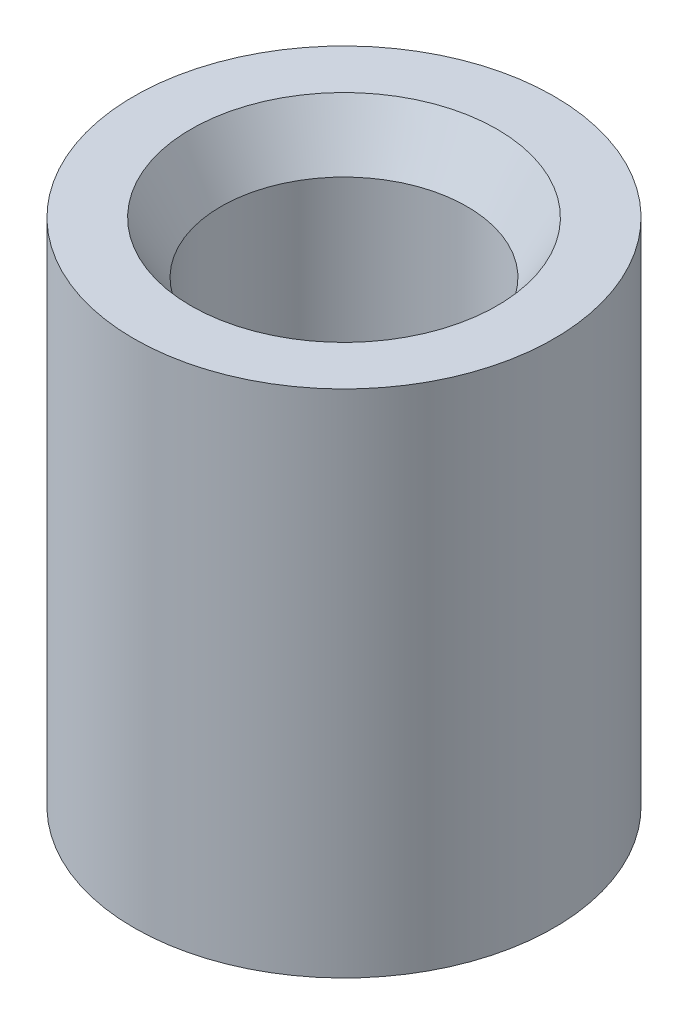
ISO-10303-21;
HEADER;
FILE_DESCRIPTION(('STEP AP214'),'2;1');
FILE_NAME('part.step','',(''),(''),'','','');
FILE_SCHEMA(('AUTOMOTIVE_DESIGN { 1 0 10303 214 1 1 1 1 }'));
ENDSEC;
DATA;
#1=APPLICATION_CONTEXT('core data for automotive mechanical design processes');
#2=APPLICATION_PROTOCOL_DEFINITION('international standard','automotive_design',2000,#1);
#3=PRODUCT_CONTEXT('',#1,'mechanical');
#4=PRODUCT('Part','Part','',(#3));
#5=PRODUCT_RELATED_PRODUCT_CATEGORY('part','',(#4));
#6=PRODUCT_DEFINITION_FORMATION('','',#4);
#7=PRODUCT_DEFINITION_CONTEXT('part definition',#1,'design');
#8=PRODUCT_DEFINITION('design','',#6,#7);
#9=PRODUCT_DEFINITION_SHAPE('','',#8);
#10=(LENGTH_UNIT() NAMED_UNIT(*) SI_UNIT(.MILLI.,.METRE.));
#11=(NAMED_UNIT(*) PLANE_ANGLE_UNIT() SI_UNIT($,.RADIAN.));
#12=(NAMED_UNIT(*) SI_UNIT($,.STERADIAN.) SOLID_ANGLE_UNIT());
#13=UNCERTAINTY_MEASURE_WITH_UNIT(LENGTH_MEASURE(1.E-05),#10,'distance_accuracy_value','');
#14=(GEOMETRIC_REPRESENTATION_CONTEXT(3) GLOBAL_UNCERTAINTY_ASSIGNED_CONTEXT((#13)) GLOBAL_UNIT_ASSIGNED_CONTEXT((#10,
#11,#12)) REPRESENTATION_CONTEXT('',''));
#15=CARTESIAN_POINT('',(0.,0.,0.));
#16=DIRECTION('',(0.,0.,1.));
#17=DIRECTION('',(1.,0.,0.));
#18=AXIS2_PLACEMENT_3D('',#15,#16,#17);
#19=CARTESIAN_POINT('',(0.,17.,0.));
#20=DIRECTION('',(0.,1.,0.));
#21=DIRECTION('',(0.,0.,1.));
#22=AXIS2_PLACEMENT_3D('',#19,#20,#21);
#23=PLANE('',#22);
#24=CARTESIAN_POINT('',(0.,17.,0.));
#25=DIRECTION('',(0.,1.,0.));
#26=DIRECTION('',(0.,0.,1.));
#27=AXIS2_PLACEMENT_3D('',#24,#25,#26);
#28=CIRCLE('',#27,5.1);
#29=CARTESIAN_POINT('',(0.,17.,5.1));
#30=VERTEX_POINT('',#29);
#31=EDGE_CURVE('E11',#30,#30,#28,.F.);
#32=ORIENTED_EDGE('',*,*,#31,.T.);
#33=EDGE_LOOP('',(#32));
#34=FACE_BOUND('',#33,.T.);
#35=CARTESIAN_POINT('',(0.,17.,0.));
#36=DIRECTION('',(0.,1.,0.));
#37=DIRECTION('',(0.,0.,1.));
#38=AXIS2_PLACEMENT_3D('',#35,#36,#37);
#39=CIRCLE('',#38,7.);
#40=CARTESIAN_POINT('',(0.,17.,7.));
#41=VERTEX_POINT('',#40);
#42=EDGE_CURVE('E59',#41,#41,#39,.T.);
#43=ORIENTED_EDGE('',*,*,#42,.T.);
#44=EDGE_LOOP('',(#43));
#45=FACE_BOUND('',#44,.T.);
#46=ADVANCED_FACE('F43',(#34,#45),#23,.T.);
#47=CARTESIAN_POINT('',(0.,0.,0.));
#48=DIRECTION('',(0.,1.,0.));
#49=DIRECTION('',(0.,0.,1.));
#50=AXIS2_PLACEMENT_3D('',#47,#48,#49);
#51=PLANE('',#50);
#52=CARTESIAN_POINT('',(0.,0.,0.));
#53=DIRECTION('',(0.,1.,0.));
#54=DIRECTION('',(0.,0.,1.));
#55=AXIS2_PLACEMENT_3D('',#52,#53,#54);
#56=CIRCLE('',#55,7.);
#57=CARTESIAN_POINT('',(0.,0.,7.));
#58=VERTEX_POINT('',#57);
#59=EDGE_CURVE('E62',#58,#58,#56,.T.);
#60=ORIENTED_EDGE('',*,*,#59,.F.);
#61=EDGE_LOOP('',(#60));
#62=FACE_BOUND('',#61,.T.);
#63=ADVANCED_FACE('F73',(#62),#51,.F.);
#64=CARTESIAN_POINT('',(0.,17.,0.));
#65=DIRECTION('',(0.,-1.,0.));
#66=DIRECTION('',(0.,0.,-1.));
#67=AXIS2_PLACEMENT_3D('',#64,#65,#66);
#68=CYLINDRICAL_SURFACE('',#67,7.);
#69=ORIENTED_EDGE('',*,*,#42,.F.);
#70=EDGE_LOOP('',(#69));
#71=FACE_BOUND('',#70,.T.);
#72=ORIENTED_EDGE('',*,*,#59,.T.);
#73=EDGE_LOOP('',(#72));
#74=FACE_BOUND('',#73,.T.);
#75=ADVANCED_FACE('F69',(#71,#74),#68,.T.);
#76=CARTESIAN_POINT('',(0.,17.,0.));
#77=DIRECTION('',(0.,-1.,0.));
#78=DIRECTION('',(0.,0.,-1.));
#79=AXIS2_PLACEMENT_3D('',#76,#77,#78);
#80=CYLINDRICAL_SURFACE('',#79,4.1);
#81=CARTESIAN_POINT('',(0.,15.2679491924311,0.));
#82=DIRECTION('',(0.,1.,0.));
#83=DIRECTION('',(0.,0.,1.));
#84=AXIS2_PLACEMENT_3D('',#81,#82,#83);
#85=CIRCLE('',#84,4.1);
#86=CARTESIAN_POINT('',(0.,15.2679491924311,4.1));
#87=VERTEX_POINT('',#86);
#88=EDGE_CURVE('E51',#87,#87,#85,.T.);
#89=ORIENTED_EDGE('',*,*,#88,.T.);
#90=EDGE_LOOP('',(#89));
#91=FACE_BOUND('',#90,.T.);
#92=CARTESIAN_POINT('',(0.,10.,0.));
#93=DIRECTION('',(0.,1.,0.));
#94=DIRECTION('',(0.,0.,1.));
#95=AXIS2_PLACEMENT_3D('',#92,#93,#94);
#96=CIRCLE('',#95,4.1);
#97=CARTESIAN_POINT('',(0.,10.,4.1));
#98=VERTEX_POINT('',#97);
#99=EDGE_CURVE('E55',#98,#98,#96,.T.);
#100=ORIENTED_EDGE('',*,*,#99,.F.);
#101=EDGE_LOOP('',(#100));
#102=FACE_BOUND('',#101,.T.);
#103=ADVANCED_FACE('F72',(#91,#102),#80,.F.);
#104=CARTESIAN_POINT('',(0.,10.,0.));
#105=DIRECTION('',(0.,1.,0.));
#106=DIRECTION('',(0.,0.,1.));
#107=AXIS2_PLACEMENT_3D('',#104,#105,#106);
#108=PLANE('',#107);
#109=ORIENTED_EDGE('',*,*,#99,.T.);
#110=EDGE_LOOP('',(#109));
#111=FACE_BOUND('',#110,.T.);
#112=ADVANCED_FACE('F85',(#111),#108,.T.);
#113=CARTESIAN_POINT('',(0.,15.2679491924311,0.));
#114=DIRECTION('',(0.,1.,0.));
#115=DIRECTION('',(0.,0.,1.));
#116=AXIS2_PLACEMENT_3D('',#113,#114,#115);
#117=CONICAL_SURFACE('',#116,4.1,0.5235987755983);
#118=ORIENTED_EDGE('',*,*,#31,.F.);
#119=EDGE_LOOP('',(#118));
#120=FACE_BOUND('',#119,.T.);
#121=ORIENTED_EDGE('',*,*,#88,.F.);
#122=EDGE_LOOP('',(#121));
#123=FACE_BOUND('',#122,.T.);
#124=ADVANCED_FACE('F46',(#120,#123),#117,.F.);
#125=CLOSED_SHELL('',(#46,#63,#75,#103,#112,#124));
#126=MANIFOLD_SOLID_BREP('B2',#125);
#127=ADVANCED_BREP_SHAPE_REPRESENTATION('',(#18,#126),#14);
#128=SHAPE_DEFINITION_REPRESENTATION(#9,#127);
ENDSEC;
END-ISO-10303-21;
